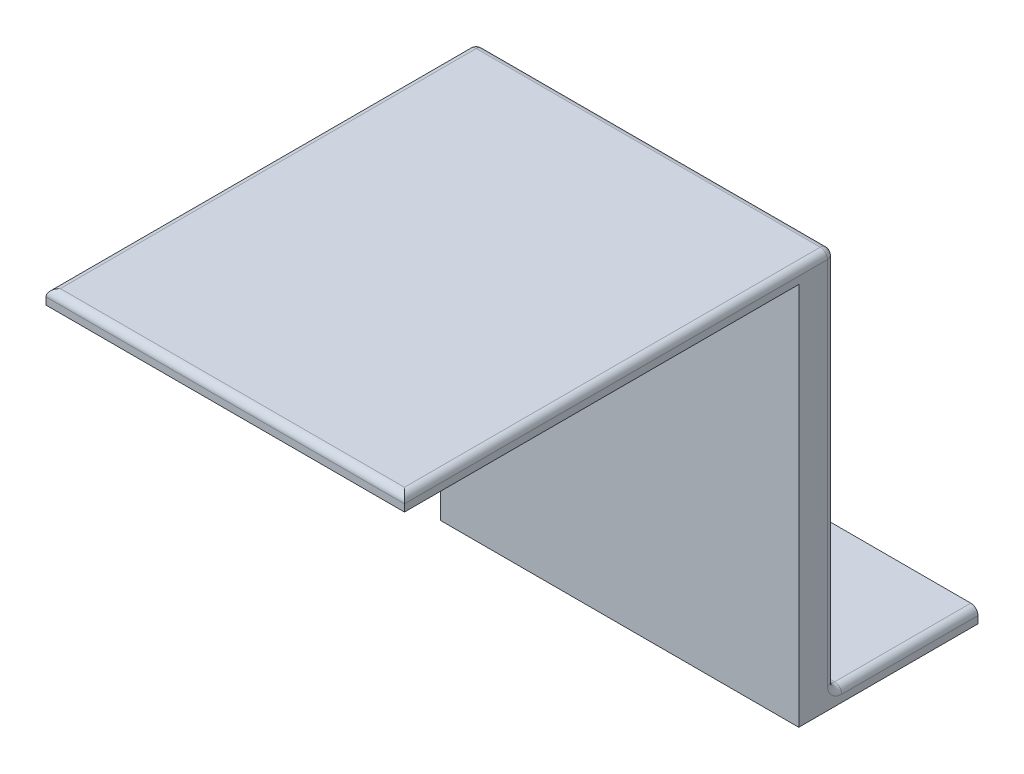
ISO-10303-21;
HEADER;
FILE_DESCRIPTION(('STEP AP214'),'2;1');
FILE_NAME('part.step','',(''),(''),'','','');
FILE_SCHEMA(('AUTOMOTIVE_DESIGN { 1 0 10303 214 1 1 1 1 }'));
ENDSEC;
DATA;
#1=APPLICATION_CONTEXT('core data for automotive mechanical design processes');
#2=APPLICATION_PROTOCOL_DEFINITION('international standard','automotive_design',2000,#1);
#3=PRODUCT_CONTEXT('',#1,'mechanical');
#4=PRODUCT('Part','Part','',(#3));
#5=PRODUCT_RELATED_PRODUCT_CATEGORY('part','',(#4));
#6=PRODUCT_DEFINITION_FORMATION('','',#4);
#7=PRODUCT_DEFINITION_CONTEXT('part definition',#1,'design');
#8=PRODUCT_DEFINITION('design','',#6,#7);
#9=PRODUCT_DEFINITION_SHAPE('','',#8);
#10=(LENGTH_UNIT() NAMED_UNIT(*) SI_UNIT(.MILLI.,.METRE.));
#11=(NAMED_UNIT(*) PLANE_ANGLE_UNIT() SI_UNIT($,.RADIAN.));
#12=(NAMED_UNIT(*) SI_UNIT($,.STERADIAN.) SOLID_ANGLE_UNIT());
#13=UNCERTAINTY_MEASURE_WITH_UNIT(LENGTH_MEASURE(1.E-05),#10,'distance_accuracy_value','');
#14=(GEOMETRIC_REPRESENTATION_CONTEXT(3) GLOBAL_UNCERTAINTY_ASSIGNED_CONTEXT((#13)) GLOBAL_UNIT_ASSIGNED_CONTEXT((#10,
#11,#12)) REPRESENTATION_CONTEXT('',''));
#15=CARTESIAN_POINT('',(0.,0.,0.));
#16=DIRECTION('',(0.,0.,1.));
#17=DIRECTION('',(1.,0.,0.));
#18=AXIS2_PLACEMENT_3D('',#15,#16,#17);
#19=CARTESIAN_POINT('',(0.,0.,0.));
#20=DIRECTION('',(0.,0.,1.));
#21=DIRECTION('',(1.,0.,0.));
#22=AXIS2_PLACEMENT_3D('',#19,#20,#21);
#23=PLANE('',#22);
#24=DIRECTION('',(0.,1.,0.));
#25=VECTOR('',#24,1.);
#26=CARTESIAN_POINT('',(52.3909090909091,0.,0.));
#27=LINE('',#26,#25);
#28=CARTESIAN_POINT('',(52.3909090909091,29.8655354534217,0.));
#29=VERTEX_POINT('',#28);
#30=CARTESIAN_POINT('',(52.3909090909092,-57.6844645465783,0.));
#31=VERTEX_POINT('',#30);
#32=EDGE_CURVE('E230',#29,#31,#27,.F.);
#33=ORIENTED_EDGE('',*,*,#32,.T.);
#34=DIRECTION('',(1.,0.,0.));
#35=VECTOR('',#34,1.);
#36=CARTESIAN_POINT('',(-30.9090909090908,-57.6844645465783,0.));
#37=LINE('',#36,#35);
#38=CARTESIAN_POINT('',(-29.2090909090908,-57.6844645465783,0.));
#39=VERTEX_POINT('',#38);
#40=EDGE_CURVE('E233',#31,#39,#37,.F.);
#41=ORIENTED_EDGE('',*,*,#40,.T.);
#42=DIRECTION('',(0.,-1.,0.));
#43=VECTOR('',#42,1.);
#44=CARTESIAN_POINT('',(-29.2090909090909,0.,0.));
#45=LINE('',#44,#43);
#46=CARTESIAN_POINT('',(-29.2090909090909,29.8655354534217,0.));
#47=VERTEX_POINT('',#46);
#48=EDGE_CURVE('E228',#39,#47,#45,.F.);
#49=ORIENTED_EDGE('',*,*,#48,.T.);
#50=DIRECTION('',(-1.,0.,0.));
#51=VECTOR('',#50,1.);
#52=CARTESIAN_POINT('',(0.,29.8655354534217,0.));
#53=LINE('',#52,#51);
#54=EDGE_CURVE('E226',#47,#29,#53,.F.);
#55=ORIENTED_EDGE('',*,*,#54,.T.);
#56=EDGE_LOOP('',(#33,#41,#49,#55));
#57=FACE_BOUND('',#56,.T.);
#58=ADVANCED_FACE('F38',(#57),#23,.F.);
#59=CARTESIAN_POINT('',(-30.9090909090908,-62.7844645465783,102.));
#60=DIRECTION('',(0.,1.,0.));
#61=DIRECTION('',(0.,0.,1.));
#62=AXIS2_PLACEMENT_3D('',#59,#60,#61);
#63=PLANE('',#62);
#64=DIRECTION('',(1.,0.,0.));
#65=VECTOR('',#64,1.);
#66=CARTESIAN_POINT('',(54.0909090909092,-62.7844645465783,8.49999999999999));
#67=LINE('',#66,#65);
#68=CARTESIAN_POINT('',(-30.9090909090909,-62.7844645465783,8.49999999999999));
#69=VERTEX_POINT('',#68);
#70=CARTESIAN_POINT('',(54.0909090909092,-62.7844645465783,8.49999999999999));
#71=VERTEX_POINT('',#70);
#72=EDGE_CURVE('E187',#69,#71,#67,.T.);
#73=ORIENTED_EDGE('',*,*,#72,.F.);
#74=DIRECTION('',(0.,0.,-1.));
#75=VECTOR('',#74,1.);
#76=CARTESIAN_POINT('',(-30.9090909090908,-62.7844645465783,102.));
#77=LINE('',#76,#75);
#78=CARTESIAN_POINT('',(-30.9090909090908,-62.7844645465783,-34.));
#79=VERTEX_POINT('',#78);
#80=EDGE_CURVE('E170',#69,#79,#77,.T.);
#81=ORIENTED_EDGE('',*,*,#80,.T.);
#82=DIRECTION('',(-1.,0.,0.));
#83=VECTOR('',#82,1.);
#84=CARTESIAN_POINT('',(-30.9090909090908,-62.7844645465783,-34.));
#85=LINE('',#84,#83);
#86=CARTESIAN_POINT('',(54.0909090909092,-62.7844645465783,-34.));
#87=VERTEX_POINT('',#86);
#88=EDGE_CURVE('E152',#87,#79,#85,.T.);
#89=ORIENTED_EDGE('',*,*,#88,.F.);
#90=DIRECTION('',(0.,0.,-1.));
#91=VECTOR('',#90,1.);
#92=CARTESIAN_POINT('',(54.0909090909092,-62.7844645465783,102.));
#93=LINE('',#92,#91);
#94=EDGE_CURVE('E163',#71,#87,#93,.T.);
#95=ORIENTED_EDGE('',*,*,#94,.F.);
#96=EDGE_LOOP('',(#73,#81,#89,#95));
#97=FACE_BOUND('',#96,.T.);
#98=ADVANCED_FACE('F173',(#97),#63,.F.);
#99=CARTESIAN_POINT('',(-30.9090909090909,31.5655354534217,102.));
#100=DIRECTION('',(1.,0.,0.));
#101=DIRECTION('',(0.,1.,0.));
#102=AXIS2_PLACEMENT_3D('',#99,#100,#101);
#103=PLANE('',#102);
#104=CARTESIAN_POINT('',(-30.9090909090908,-57.6844645465783,-1.7));
#105=DIRECTION('',(1.,0.,0.));
#106=DIRECTION('',(0.,1.,0.));
#107=AXIS2_PLACEMENT_3D('',#104,#105,#106);
#108=CIRCLE('',#107,3.4);
#109=CARTESIAN_POINT('',(-30.9090909090908,-61.0844645465783,-1.7));
#110=VERTEX_POINT('',#109);
#111=CARTESIAN_POINT('',(-30.9090909090908,-57.6844645465783,1.7));
#112=VERTEX_POINT('',#111);
#113=EDGE_CURVE('E221',#110,#112,#108,.F.);
#114=ORIENTED_EDGE('',*,*,#113,.F.);
#115=DIRECTION('',(0.,0.,1.));
#116=VECTOR('',#115,1.);
#117=CARTESIAN_POINT('',(-30.9090909090908,-61.0844645465783,102.));
#118=LINE('',#117,#116);
#119=CARTESIAN_POINT('',(-30.9090909090908,-61.0844645465783,-34.));
#120=VERTEX_POINT('',#119);
#121=EDGE_CURVE('E224',#110,#120,#118,.F.);
#122=ORIENTED_EDGE('',*,*,#121,.T.);
#123=DIRECTION('',(0.,1.,0.));
#124=VECTOR('',#123,1.);
#125=CARTESIAN_POINT('',(-30.9090909090908,-62.7844645465783,-34.));
#126=LINE('',#125,#124);
#127=EDGE_CURVE('E279',#79,#120,#126,.T.);
#128=ORIENTED_EDGE('',*,*,#127,.F.);
#129=ORIENTED_EDGE('',*,*,#80,.F.);
#130=DIRECTION('',(0.,-1.,0.));
#131=VECTOR('',#130,1.);
#132=CARTESIAN_POINT('',(-30.9090909090909,-62.7844645465783,8.49999999999999));
#133=LINE('',#132,#131);
#134=CARTESIAN_POINT('',(-30.9090909090909,28.1655354534217,8.49999999999999));
#135=VERTEX_POINT('',#134);
#136=EDGE_CURVE('E185',#135,#69,#133,.T.);
#137=ORIENTED_EDGE('',*,*,#136,.F.);
#138=DIRECTION('',(0.,0.,1.));
#139=VECTOR('',#138,1.);
#140=CARTESIAN_POINT('',(-30.9090909090909,28.1655354534217,8.49999999999999));
#141=LINE('',#140,#139);
#142=CARTESIAN_POINT('',(-30.9090909090909,28.1655354534217,102.));
#143=VERTEX_POINT('',#142);
#144=EDGE_CURVE('E190',#135,#143,#141,.T.);
#145=ORIENTED_EDGE('',*,*,#144,.T.);
#146=DIRECTION('',(0.,-1.,0.));
#147=VECTOR('',#146,1.);
#148=CARTESIAN_POINT('',(-30.9090909090909,31.5655354534217,102.));
#149=LINE('',#148,#147);
#150=CARTESIAN_POINT('',(-30.9090909090909,29.8655354534217,102.));
#151=VERTEX_POINT('',#150);
#152=EDGE_CURVE('E193',#151,#143,#149,.T.);
#153=ORIENTED_EDGE('',*,*,#152,.F.);
#154=DIRECTION('',(0.,0.,-1.));
#155=VECTOR('',#154,1.);
#156=CARTESIAN_POINT('',(-30.9090909090909,29.8655354534217,102.));
#157=LINE('',#156,#155);
#158=CARTESIAN_POINT('',(-30.9090909090909,29.8655354534217,1.7));
#159=VERTEX_POINT('',#158);
#160=EDGE_CURVE('E217',#151,#159,#157,.T.);
#161=ORIENTED_EDGE('',*,*,#160,.T.);
#162=DIRECTION('',(0.,-1.,0.));
#163=VECTOR('',#162,1.);
#164=CARTESIAN_POINT('',(-30.9090909090909,31.5655354534217,1.7));
#165=LINE('',#164,#163);
#166=EDGE_CURVE('E219',#159,#112,#165,.T.);
#167=ORIENTED_EDGE('',*,*,#166,.T.);
#168=EDGE_LOOP('',(#114,#122,#128,#129,#137,#145,#153,#161,#167));
#169=FACE_BOUND('',#168,.T.);
#170=ADVANCED_FACE('F338',(#169),#103,.F.);
#171=CARTESIAN_POINT('',(54.0909090909091,31.5655354534217,102.));
#172=DIRECTION('',(-1.,0.,0.));
#173=DIRECTION('',(0.,-1.,0.));
#174=AXIS2_PLACEMENT_3D('',#171,#172,#173);
#175=PLANE('',#174);
#176=DIRECTION('',(0.,-1.,0.));
#177=VECTOR('',#176,1.);
#178=CARTESIAN_POINT('',(54.0909090909092,-62.7844645465783,-34.));
#179=LINE('',#178,#177);
#180=CARTESIAN_POINT('',(54.0909090909092,-61.0844645465783,-34.));
#181=VERTEX_POINT('',#180);
#182=EDGE_CURVE('E146',#181,#87,#179,.T.);
#183=ORIENTED_EDGE('',*,*,#182,.F.);
#184=DIRECTION('',(0.,0.,1.));
#185=VECTOR('',#184,1.);
#186=CARTESIAN_POINT('',(54.0909090909092,-61.0844645465783,102.));
#187=LINE('',#186,#185);
#188=CARTESIAN_POINT('',(54.0909090909092,-61.0844645465783,-1.7));
#189=VERTEX_POINT('',#188);
#190=EDGE_CURVE('E206',#181,#189,#187,.T.);
#191=ORIENTED_EDGE('',*,*,#190,.T.);
#192=CARTESIAN_POINT('',(54.0909090909092,-57.6844645465783,-1.7));
#193=DIRECTION('',(-1.,0.,0.));
#194=DIRECTION('',(0.,-1.,0.));
#195=AXIS2_PLACEMENT_3D('',#192,#193,#194);
#196=CIRCLE('',#195,3.4);
#197=CARTESIAN_POINT('',(54.0909090909092,-57.6844645465783,1.7));
#198=VERTEX_POINT('',#197);
#199=EDGE_CURVE('E203',#198,#189,#196,.F.);
#200=ORIENTED_EDGE('',*,*,#199,.F.);
#201=DIRECTION('',(0.,1.,0.));
#202=VECTOR('',#201,1.);
#203=CARTESIAN_POINT('',(54.0909090909091,31.5655354534217,1.7));
#204=LINE('',#203,#202);
#205=CARTESIAN_POINT('',(54.0909090909091,29.8655354534217,1.7));
#206=VERTEX_POINT('',#205);
#207=EDGE_CURVE('E201',#198,#206,#204,.T.);
#208=ORIENTED_EDGE('',*,*,#207,.T.);
#209=DIRECTION('',(0.,0.,-1.));
#210=VECTOR('',#209,1.);
#211=CARTESIAN_POINT('',(54.0909090909091,29.8655354534217,102.));
#212=LINE('',#211,#210);
#213=CARTESIAN_POINT('',(54.0909090909091,29.8655354534217,102.));
#214=VERTEX_POINT('',#213);
#215=EDGE_CURVE('E199',#206,#214,#212,.F.);
#216=ORIENTED_EDGE('',*,*,#215,.T.);
#217=DIRECTION('',(0.,1.,0.));
#218=VECTOR('',#217,1.);
#219=CARTESIAN_POINT('',(54.0909090909091,31.5655354534217,102.));
#220=LINE('',#219,#218);
#221=CARTESIAN_POINT('',(54.0909090909091,28.1655354534217,102.));
#222=VERTEX_POINT('',#221);
#223=EDGE_CURVE('E171',#222,#214,#220,.T.);
#224=ORIENTED_EDGE('',*,*,#223,.F.);
#225=DIRECTION('',(0.,0.,1.));
#226=VECTOR('',#225,1.);
#227=CARTESIAN_POINT('',(54.0909090909092,28.1655354534217,8.49999999999999));
#228=LINE('',#227,#226);
#229=CARTESIAN_POINT('',(54.0909090909092,28.1655354534217,8.49999999999999));
#230=VERTEX_POINT('',#229);
#231=EDGE_CURVE('E188',#230,#222,#228,.T.);
#232=ORIENTED_EDGE('',*,*,#231,.F.);
#233=DIRECTION('',(0.,1.,0.));
#234=VECTOR('',#233,1.);
#235=CARTESIAN_POINT('',(54.0909090909092,-62.7844645465783,8.49999999999999));
#236=LINE('',#235,#234);
#237=EDGE_CURVE('E167',#71,#230,#236,.T.);
#238=ORIENTED_EDGE('',*,*,#237,.F.);
#239=ORIENTED_EDGE('',*,*,#94,.T.);
#240=EDGE_LOOP('',(#183,#191,#200,#208,#216,#224,#232,#238,#239));
#241=FACE_BOUND('',#240,.T.);
#242=ADVANCED_FACE('F164',(#241),#175,.F.);
#243=CARTESIAN_POINT('',(-30.9090909090909,31.5655354534217,102.));
#244=DIRECTION('',(0.,-1.,0.));
#245=DIRECTION('',(0.,0.,-1.));
#246=AXIS2_PLACEMENT_3D('',#243,#244,#245);
#247=PLANE('',#246);
#248=DIRECTION('',(-1.,0.,0.));
#249=VECTOR('',#248,1.);
#250=CARTESIAN_POINT('',(54.0909090909091,31.5655354534217,100.3));
#251=LINE('',#250,#249);
#252=CARTESIAN_POINT('',(-29.2090909090909,31.5655354534217,100.3));
#253=VERTEX_POINT('',#252);
#254=CARTESIAN_POINT('',(52.3909090909091,31.5655354534217,100.3));
#255=VERTEX_POINT('',#254);
#256=EDGE_CURVE('E55',#253,#255,#251,.F.);
#257=ORIENTED_EDGE('',*,*,#256,.T.);
#258=DIRECTION('',(0.,0.,-1.));
#259=VECTOR('',#258,1.);
#260=CARTESIAN_POINT('',(52.3909090909091,31.5655354534217,102.));
#261=LINE('',#260,#259);
#262=CARTESIAN_POINT('',(52.3909090909091,31.5655354534217,1.7));
#263=VERTEX_POINT('',#262);
#264=EDGE_CURVE('E47',#255,#263,#261,.T.);
#265=ORIENTED_EDGE('',*,*,#264,.T.);
#266=DIRECTION('',(-1.,0.,0.));
#267=VECTOR('',#266,1.);
#268=CARTESIAN_POINT('',(-30.9090909090909,31.5655354534217,1.7));
#269=LINE('',#268,#267);
#270=CARTESIAN_POINT('',(-29.2090909090909,31.5655354534217,1.7));
#271=VERTEX_POINT('',#270);
#272=EDGE_CURVE('E235',#263,#271,#269,.T.);
#273=ORIENTED_EDGE('',*,*,#272,.T.);
#274=DIRECTION('',(0.,0.,-1.));
#275=VECTOR('',#274,1.);
#276=CARTESIAN_POINT('',(-29.2090909090909,31.5655354534217,102.));
#277=LINE('',#276,#275);
#278=EDGE_CURVE('E60',#271,#253,#277,.F.);
#279=ORIENTED_EDGE('',*,*,#278,.T.);
#280=EDGE_LOOP('',(#257,#265,#273,#279));
#281=FACE_BOUND('',#280,.T.);
#282=ADVANCED_FACE('F343',(#281),#247,.F.);
#283=CARTESIAN_POINT('',(0.,0.,102.));
#284=DIRECTION('',(0.,0.,1.));
#285=DIRECTION('',(1.,0.,0.));
#286=AXIS2_PLACEMENT_3D('',#283,#284,#285);
#287=PLANE('',#286);
#288=ORIENTED_EDGE('',*,*,#223,.T.);
#289=DIRECTION('',(-1.,0.,0.));
#290=VECTOR('',#289,1.);
#291=CARTESIAN_POINT('',(-30.9090909090909,29.8655354534217,102.));
#292=LINE('',#291,#290);
#293=EDGE_CURVE('E11',#214,#151,#292,.T.);
#294=ORIENTED_EDGE('',*,*,#293,.T.);
#295=ORIENTED_EDGE('',*,*,#152,.T.);
#296=DIRECTION('',(-1.,0.,0.));
#297=VECTOR('',#296,1.);
#298=CARTESIAN_POINT('',(54.0909090909092,28.1655354534217,102.));
#299=LINE('',#298,#297);
#300=EDGE_CURVE('E175',#222,#143,#299,.T.);
#301=ORIENTED_EDGE('',*,*,#300,.F.);
#302=EDGE_LOOP('',(#288,#294,#295,#301));
#303=FACE_BOUND('',#302,.T.);
#304=ADVANCED_FACE('F322',(#303),#287,.T.);
#305=CARTESIAN_POINT('',(54.0909090909092,28.1655354534217,8.49999999999999));
#306=DIRECTION('',(0.,1.,0.));
#307=DIRECTION('',(-1.,0.,0.));
#308=AXIS2_PLACEMENT_3D('',#305,#306,#307);
#309=PLANE('',#308);
#310=ORIENTED_EDGE('',*,*,#300,.T.);
#311=ORIENTED_EDGE('',*,*,#144,.F.);
#312=DIRECTION('',(-1.,0.,0.));
#313=VECTOR('',#312,1.);
#314=CARTESIAN_POINT('',(54.0909090909092,28.1655354534217,8.49999999999999));
#315=LINE('',#314,#313);
#316=EDGE_CURVE('E182',#230,#135,#315,.T.);
#317=ORIENTED_EDGE('',*,*,#316,.F.);
#318=ORIENTED_EDGE('',*,*,#231,.T.);
#319=EDGE_LOOP('',(#310,#311,#317,#318));
#320=FACE_BOUND('',#319,.T.);
#321=ADVANCED_FACE('F504',(#320),#309,.F.);
#322=CARTESIAN_POINT('',(0.,0.,8.49999999999999));
#323=DIRECTION('',(0.,0.,1.));
#324=DIRECTION('',(1.,0.,0.));
#325=AXIS2_PLACEMENT_3D('',#322,#323,#324);
#326=PLANE('',#325);
#327=ORIENTED_EDGE('',*,*,#237,.T.);
#328=ORIENTED_EDGE('',*,*,#316,.T.);
#329=ORIENTED_EDGE('',*,*,#136,.T.);
#330=ORIENTED_EDGE('',*,*,#72,.T.);
#331=EDGE_LOOP('',(#327,#328,#329,#330));
#332=FACE_BOUND('',#331,.T.);
#333=ADVANCED_FACE('F465',(#332),#326,.T.);
#334=CARTESIAN_POINT('',(-30.9090909090908,-59.3844645465783,-34.));
#335=DIRECTION('',(0.,-1.,0.));
#336=DIRECTION('',(1.,0.,0.));
#337=AXIS2_PLACEMENT_3D('',#334,#335,#336);
#338=PLANE('',#337);
#339=DIRECTION('',(1.,0.,0.));
#340=VECTOR('',#339,1.);
#341=CARTESIAN_POINT('',(54.0909090909092,-59.3844645465783,-1.7));
#342=LINE('',#341,#340);
#343=CARTESIAN_POINT('',(-29.2090909090908,-59.3844645465783,-1.7));
#344=VERTEX_POINT('',#343);
#345=CARTESIAN_POINT('',(52.3909090909092,-59.3844645465783,-1.7));
#346=VERTEX_POINT('',#345);
#347=EDGE_CURVE('E208',#344,#346,#342,.T.);
#348=ORIENTED_EDGE('',*,*,#347,.T.);
#349=DIRECTION('',(0.,0.,1.));
#350=VECTOR('',#349,1.);
#351=CARTESIAN_POINT('',(52.3909090909092,-59.3844645465783,-34.));
#352=LINE('',#351,#350);
#353=CARTESIAN_POINT('',(52.3909090909092,-59.3844645465783,-34.));
#354=VERTEX_POINT('',#353);
#355=EDGE_CURVE('E212',#346,#354,#352,.F.);
#356=ORIENTED_EDGE('',*,*,#355,.T.);
#357=DIRECTION('',(1.,0.,0.));
#358=VECTOR('',#357,1.);
#359=CARTESIAN_POINT('',(-30.9090909090908,-59.3844645465783,-34.));
#360=LINE('',#359,#358);
#361=CARTESIAN_POINT('',(-29.2090909090908,-59.3844645465783,-34.));
#362=VERTEX_POINT('',#361);
#363=EDGE_CURVE('E159',#362,#354,#360,.T.);
#364=ORIENTED_EDGE('',*,*,#363,.F.);
#365=DIRECTION('',(0.,0.,1.));
#366=VECTOR('',#365,1.);
#367=CARTESIAN_POINT('',(-29.2090909090908,-59.3844645465783,-34.));
#368=LINE('',#367,#366);
#369=EDGE_CURVE('E210',#362,#344,#368,.T.);
#370=ORIENTED_EDGE('',*,*,#369,.T.);
#371=EDGE_LOOP('',(#348,#356,#364,#370));
#372=FACE_BOUND('',#371,.T.);
#373=ADVANCED_FACE('F457',(#372),#338,.F.);
#374=CARTESIAN_POINT('',(0.,0.,-34.));
#375=DIRECTION('',(0.,0.,-1.));
#376=DIRECTION('',(-1.,0.,0.));
#377=AXIS2_PLACEMENT_3D('',#374,#375,#376);
#378=PLANE('',#377);
#379=ORIENTED_EDGE('',*,*,#363,.T.);
#380=CARTESIAN_POINT('',(52.3909090909092,-61.0844645465783,-34.));
#381=DIRECTION('',(0.,0.,-1.));
#382=DIRECTION('',(-1.,0.,0.));
#383=AXIS2_PLACEMENT_3D('',#380,#381,#382);
#384=CIRCLE('',#383,1.7);
#385=EDGE_CURVE('E155',#354,#181,#384,.T.);
#386=ORIENTED_EDGE('',*,*,#385,.T.);
#387=ORIENTED_EDGE('',*,*,#182,.T.);
#388=ORIENTED_EDGE('',*,*,#88,.T.);
#389=ORIENTED_EDGE('',*,*,#127,.T.);
#390=CARTESIAN_POINT('',(-29.2090909090908,-61.0844645465783,-34.));
#391=DIRECTION('',(0.,0.,-1.));
#392=DIRECTION('',(-1.,0.,0.));
#393=AXIS2_PLACEMENT_3D('',#390,#391,#392);
#394=CIRCLE('',#393,1.7);
#395=EDGE_CURVE('E214',#120,#362,#394,.T.);
#396=ORIENTED_EDGE('',*,*,#395,.T.);
#397=EDGE_LOOP('',(#379,#386,#387,#388,#389,#396));
#398=FACE_BOUND('',#397,.T.);
#399=ADVANCED_FACE('F149',(#398),#378,.T.);
#400=CARTESIAN_POINT('',(-29.2090909090909,29.8655354534217,102.));
#401=DIRECTION('',(0.,0.,-1.));
#402=DIRECTION('',(-1.,0.,0.));
#403=AXIS2_PLACEMENT_3D('',#400,#401,#402);
#404=CYLINDRICAL_SURFACE('',#403,1.7);
#405=CARTESIAN_POINT('',(-29.2090909090909,29.8655354534217,1.7));
#406=DIRECTION('',(0.,0.,-1.));
#407=DIRECTION('',(-1.,0.,0.));
#408=AXIS2_PLACEMENT_3D('',#405,#406,#407);
#409=CIRCLE('',#408,1.7);
#410=EDGE_CURVE('E272',#159,#271,#409,.T.);
#411=ORIENTED_EDGE('',*,*,#410,.F.);
#412=ORIENTED_EDGE('',*,*,#160,.F.);
#413=CARTESIAN_POINT('',(-29.2090909090909,29.8655354534217,100.3));
#414=DIRECTION('',(-0.707106781186547,0.,-0.707106781186547));
#415=DIRECTION('',(0.707106781186547,0.,-0.707106781186547));
#416=AXIS2_PLACEMENT_3D('',#413,#414,#415);
#417=ELLIPSE('',#416,2.40416305603426,1.7);
#418=EDGE_CURVE('E42',#253,#151,#417,.F.);
#419=ORIENTED_EDGE('',*,*,#418,.F.);
#420=ORIENTED_EDGE('',*,*,#278,.F.);
#421=EDGE_LOOP('',(#411,#412,#419,#420));
#422=FACE_BOUND('',#421,.T.);
#423=ADVANCED_FACE('F40',(#422),#404,.T.);
#424=CARTESIAN_POINT('',(0.,29.8655354534217,100.3));
#425=DIRECTION('',(1.,0.,0.));
#426=DIRECTION('',(0.,0.,-1.));
#427=AXIS2_PLACEMENT_3D('',#424,#425,#426);
#428=CYLINDRICAL_SURFACE('',#427,1.7);
#429=ORIENTED_EDGE('',*,*,#418,.T.);
#430=ORIENTED_EDGE('',*,*,#293,.F.);
#431=CARTESIAN_POINT('',(52.3909090909091,29.8655354534217,100.3));
#432=DIRECTION('',(0.707106781186547,0.,-0.707106781186547));
#433=DIRECTION('',(0.707106781186547,0.,0.707106781186547));
#434=AXIS2_PLACEMENT_3D('',#431,#432,#433);
#435=ELLIPSE('',#434,2.40416305603426,1.7);
#436=EDGE_CURVE('E270',#255,#214,#435,.T.);
#437=ORIENTED_EDGE('',*,*,#436,.F.);
#438=ORIENTED_EDGE('',*,*,#256,.F.);
#439=EDGE_LOOP('',(#429,#430,#437,#438));
#440=FACE_BOUND('',#439,.T.);
#441=ADVANCED_FACE('F324',(#440),#428,.T.);
#442=CARTESIAN_POINT('',(-29.2090909090909,29.8655354534217,1.7));
#443=DIRECTION('',(0.,1.,0.));
#444=DIRECTION('',(0.,0.,1.));
#445=AXIS2_PLACEMENT_3D('',#442,#443,#444);
#446=SPHERICAL_SURFACE('',#445,1.7);
#447=CARTESIAN_POINT('',(-29.2090909090909,29.8655354534217,1.7));
#448=DIRECTION('',(0.,1.,0.));
#449=DIRECTION('',(0.,0.,1.));
#450=AXIS2_PLACEMENT_3D('',#447,#448,#449);
#451=CIRCLE('',#450,1.7);
#452=EDGE_CURVE('E264',#159,#47,#451,.F.);
#453=ORIENTED_EDGE('',*,*,#452,.F.);
#454=ORIENTED_EDGE('',*,*,#410,.T.);
#455=CARTESIAN_POINT('',(-29.2090909090909,29.8655354534217,1.7));
#456=DIRECTION('',(-1.,0.,0.));
#457=DIRECTION('',(0.,0.,1.));
#458=AXIS2_PLACEMENT_3D('',#455,#456,#457);
#459=CIRCLE('',#458,1.7);
#460=EDGE_CURVE('E267',#47,#271,#459,.F.);
#461=ORIENTED_EDGE('',*,*,#460,.F.);
#462=EDGE_LOOP('',(#453,#454,#461));
#463=FACE_BOUND('',#462,.T.);
#464=ADVANCED_FACE('F326',(#463),#446,.T.);
#465=CARTESIAN_POINT('',(52.3909090909091,29.8655354534217,102.));
#466=DIRECTION('',(0.,0.,-1.));
#467=DIRECTION('',(-1.,0.,0.));
#468=AXIS2_PLACEMENT_3D('',#465,#466,#467);
#469=CYLINDRICAL_SURFACE('',#468,1.7);
#470=ORIENTED_EDGE('',*,*,#436,.T.);
#471=ORIENTED_EDGE('',*,*,#215,.F.);
#472=CARTESIAN_POINT('',(52.3909090909091,29.8655354534217,1.7));
#473=DIRECTION('',(0.,0.,-1.));
#474=DIRECTION('',(-1.,0.,0.));
#475=AXIS2_PLACEMENT_3D('',#472,#473,#474);
#476=CIRCLE('',#475,1.7);
#477=EDGE_CURVE('E261',#263,#206,#476,.T.);
#478=ORIENTED_EDGE('',*,*,#477,.F.);
#479=ORIENTED_EDGE('',*,*,#264,.F.);
#480=EDGE_LOOP('',(#470,#471,#478,#479));
#481=FACE_BOUND('',#480,.T.);
#482=ADVANCED_FACE('F318',(#481),#469,.T.);
#483=CARTESIAN_POINT('',(-30.9090909090909,29.8655354534217,1.7));
#484=DIRECTION('',(-1.,0.,0.));
#485=DIRECTION('',(0.,0.,1.));
#486=AXIS2_PLACEMENT_3D('',#483,#484,#485);
#487=CYLINDRICAL_SURFACE('',#486,1.7);
#488=ORIENTED_EDGE('',*,*,#460,.T.);
#489=ORIENTED_EDGE('',*,*,#272,.F.);
#490=CARTESIAN_POINT('',(52.3909090909091,29.8655354534217,1.7));
#491=DIRECTION('',(1.,0.,0.));
#492=DIRECTION('',(0.,0.,-1.));
#493=AXIS2_PLACEMENT_3D('',#490,#491,#492);
#494=CIRCLE('',#493,1.7);
#495=EDGE_CURVE('E259',#29,#263,#494,.T.);
#496=ORIENTED_EDGE('',*,*,#495,.F.);
#497=ORIENTED_EDGE('',*,*,#54,.F.);
#498=EDGE_LOOP('',(#488,#489,#496,#497));
#499=FACE_BOUND('',#498,.T.);
#500=ADVANCED_FACE('F312',(#499),#487,.T.);
#501=CARTESIAN_POINT('',(-29.2090909090909,31.5655354534217,1.7));
#502=DIRECTION('',(0.,-1.,0.));
#503=DIRECTION('',(1.,0.,0.));
#504=AXIS2_PLACEMENT_3D('',#501,#502,#503);
#505=CYLINDRICAL_SURFACE('',#504,1.7);
#506=ORIENTED_EDGE('',*,*,#452,.T.);
#507=ORIENTED_EDGE('',*,*,#48,.F.);
#508=CARTESIAN_POINT('',(-29.2090909090908,-57.6844645465783,1.7));
#509=DIRECTION('',(0.,-1.,0.));
#510=DIRECTION('',(0.,0.,-1.));
#511=AXIS2_PLACEMENT_3D('',#508,#509,#510);
#512=CIRCLE('',#511,1.7);
#513=EDGE_CURVE('E256',#112,#39,#512,.T.);
#514=ORIENTED_EDGE('',*,*,#513,.F.);
#515=ORIENTED_EDGE('',*,*,#166,.F.);
#516=EDGE_LOOP('',(#506,#507,#514,#515));
#517=FACE_BOUND('',#516,.T.);
#518=ADVANCED_FACE('F368',(#517),#505,.T.);
#519=CARTESIAN_POINT('',(-29.2090909090908,-61.0844645465783,-34.));
#520=DIRECTION('',(0.,0.,1.));
#521=DIRECTION('',(1.,0.,0.));
#522=AXIS2_PLACEMENT_3D('',#519,#520,#521);
#523=CYLINDRICAL_SURFACE('',#522,1.7);
#524=ORIENTED_EDGE('',*,*,#395,.F.);
#525=ORIENTED_EDGE('',*,*,#121,.F.);
#526=CARTESIAN_POINT('',(-29.2090909090908,-61.0844645465783,-1.7));
#527=DIRECTION('',(0.,0.,1.));
#528=DIRECTION('',(1.,0.,0.));
#529=AXIS2_PLACEMENT_3D('',#526,#527,#528);
#530=CIRCLE('',#529,1.7);
#531=EDGE_CURVE('E253',#344,#110,#530,.T.);
#532=ORIENTED_EDGE('',*,*,#531,.F.);
#533=ORIENTED_EDGE('',*,*,#369,.F.);
#534=EDGE_LOOP('',(#524,#525,#532,#533));
#535=FACE_BOUND('',#534,.T.);
#536=ADVANCED_FACE('F365',(#535),#523,.T.);
#537=CARTESIAN_POINT('',(52.3909090909091,29.8655354534217,1.7));
#538=DIRECTION('',(0.,1.,0.));
#539=DIRECTION('',(0.,0.,1.));
#540=AXIS2_PLACEMENT_3D('',#537,#538,#539);
#541=SPHERICAL_SURFACE('',#540,1.7);
#542=ORIENTED_EDGE('',*,*,#495,.T.);
#543=ORIENTED_EDGE('',*,*,#477,.T.);
#544=CARTESIAN_POINT('',(52.3909090909091,29.8655354534217,1.7));
#545=DIRECTION('',(0.,1.,0.));
#546=DIRECTION('',(0.,0.,1.));
#547=AXIS2_PLACEMENT_3D('',#544,#545,#546);
#548=CIRCLE('',#547,1.7);
#549=EDGE_CURVE('E250',#29,#206,#548,.F.);
#550=ORIENTED_EDGE('',*,*,#549,.F.);
#551=EDGE_LOOP('',(#542,#543,#550));
#552=FACE_BOUND('',#551,.T.);
#553=ADVANCED_FACE('F315',(#552),#541,.T.);
#554=CARTESIAN_POINT('',(-29.2090909090908,-57.6844645465783,-1.7));
#555=DIRECTION('',(1.,0.,0.));
#556=DIRECTION('',(0.,1.,0.));
#557=AXIS2_PLACEMENT_3D('',#554,#555,#556);
#558=TOROIDAL_SURFACE('',#557,3.4,1.7);
#559=ORIENTED_EDGE('',*,*,#113,.T.);
#560=ORIENTED_EDGE('',*,*,#513,.T.);
#561=CARTESIAN_POINT('',(-29.2090909090908,-57.6844645465783,-1.7));
#562=DIRECTION('',(1.,0.,0.));
#563=DIRECTION('',(0.,1.,0.));
#564=AXIS2_PLACEMENT_3D('',#561,#562,#563);
#565=CIRCLE('',#564,1.7);
#566=EDGE_CURVE('E247',#344,#39,#565,.F.);
#567=ORIENTED_EDGE('',*,*,#566,.F.);
#568=ORIENTED_EDGE('',*,*,#531,.T.);
#569=EDGE_LOOP('',(#559,#560,#567,#568));
#570=FACE_BOUND('',#569,.T.);
#571=ADVANCED_FACE('F359',(#570),#558,.T.);
#572=CARTESIAN_POINT('',(52.3909090909091,31.5655354534217,1.7));
#573=DIRECTION('',(0.,1.,0.));
#574=DIRECTION('',(-1.,0.,0.));
#575=AXIS2_PLACEMENT_3D('',#572,#573,#574);
#576=CYLINDRICAL_SURFACE('',#575,1.7);
#577=ORIENTED_EDGE('',*,*,#549,.T.);
#578=ORIENTED_EDGE('',*,*,#207,.F.);
#579=CARTESIAN_POINT('',(52.3909090909092,-57.6844645465783,1.7));
#580=DIRECTION('',(0.,-1.,0.));
#581=DIRECTION('',(0.,0.,-1.));
#582=AXIS2_PLACEMENT_3D('',#579,#580,#581);
#583=CIRCLE('',#582,1.7);
#584=EDGE_CURVE('E244',#31,#198,#583,.T.);
#585=ORIENTED_EDGE('',*,*,#584,.F.);
#586=ORIENTED_EDGE('',*,*,#32,.F.);
#587=EDGE_LOOP('',(#577,#578,#585,#586));
#588=FACE_BOUND('',#587,.T.);
#589=ADVANCED_FACE('F296',(#588),#576,.T.);
#590=CARTESIAN_POINT('',(-30.9090909090908,-57.6844645465783,-1.7));
#591=DIRECTION('',(-1.,0.,0.));
#592=DIRECTION('',(0.,-1.,0.));
#593=AXIS2_PLACEMENT_3D('',#590,#591,#592);
#594=CYLINDRICAL_SURFACE('',#593,1.7);
#595=ORIENTED_EDGE('',*,*,#566,.T.);
#596=ORIENTED_EDGE('',*,*,#40,.F.);
#597=CARTESIAN_POINT('',(52.3909090909091,-57.6844645465783,-1.7));
#598=DIRECTION('',(-1.,0.,0.));
#599=DIRECTION('',(0.,-1.,0.));
#600=AXIS2_PLACEMENT_3D('',#597,#598,#599);
#601=CIRCLE('',#600,1.7);
#602=EDGE_CURVE('E242',#346,#31,#601,.T.);
#603=ORIENTED_EDGE('',*,*,#602,.F.);
#604=ORIENTED_EDGE('',*,*,#347,.F.);
#605=EDGE_LOOP('',(#595,#596,#603,#604));
#606=FACE_BOUND('',#605,.T.);
#607=ADVANCED_FACE('F304',(#606),#594,.F.);
#608=CARTESIAN_POINT('',(52.3909090909091,-57.6844645465783,-1.7));
#609=DIRECTION('',(-1.,0.,0.));
#610=DIRECTION('',(0.,-1.,0.));
#611=AXIS2_PLACEMENT_3D('',#608,#609,#610);
#612=TOROIDAL_SURFACE('',#611,3.4,1.7);
#613=ORIENTED_EDGE('',*,*,#584,.T.);
#614=ORIENTED_EDGE('',*,*,#199,.T.);
#615=CARTESIAN_POINT('',(52.3909090909092,-61.0844645465783,-1.7));
#616=DIRECTION('',(0.,0.,1.));
#617=DIRECTION('',(1.,0.,0.));
#618=AXIS2_PLACEMENT_3D('',#615,#616,#617);
#619=CIRCLE('',#618,1.7);
#620=EDGE_CURVE('E240',#346,#189,#619,.F.);
#621=ORIENTED_EDGE('',*,*,#620,.F.);
#622=ORIENTED_EDGE('',*,*,#602,.T.);
#623=EDGE_LOOP('',(#613,#614,#621,#622));
#624=FACE_BOUND('',#623,.T.);
#625=ADVANCED_FACE('F300',(#624),#612,.T.);
#626=CARTESIAN_POINT('',(52.3909090909092,-61.0844645465783,102.));
#627=DIRECTION('',(0.,0.,1.));
#628=DIRECTION('',(1.,0.,0.));
#629=AXIS2_PLACEMENT_3D('',#626,#627,#628);
#630=CYLINDRICAL_SURFACE('',#629,1.7);
#631=ORIENTED_EDGE('',*,*,#385,.F.);
#632=ORIENTED_EDGE('',*,*,#355,.F.);
#633=ORIENTED_EDGE('',*,*,#620,.T.);
#634=ORIENTED_EDGE('',*,*,#190,.F.);
#635=EDGE_LOOP('',(#631,#632,#633,#634));
#636=FACE_BOUND('',#635,.T.);
#637=ADVANCED_FACE('F289',(#636),#630,.T.);
#638=CLOSED_SHELL('',(#58,#98,#170,#242,#282,#304,#321,#333,#373,#399,#423,#441,#464,#482,#500,
#518,#536,#553,#571,#589,#607,#625,#637));
#639=MANIFOLD_SOLID_BREP('B2',#638);
#640=ADVANCED_BREP_SHAPE_REPRESENTATION('',(#18,#639),#14);
#641=SHAPE_DEFINITION_REPRESENTATION(#9,#640);
ENDSEC;
END-ISO-10303-21;
